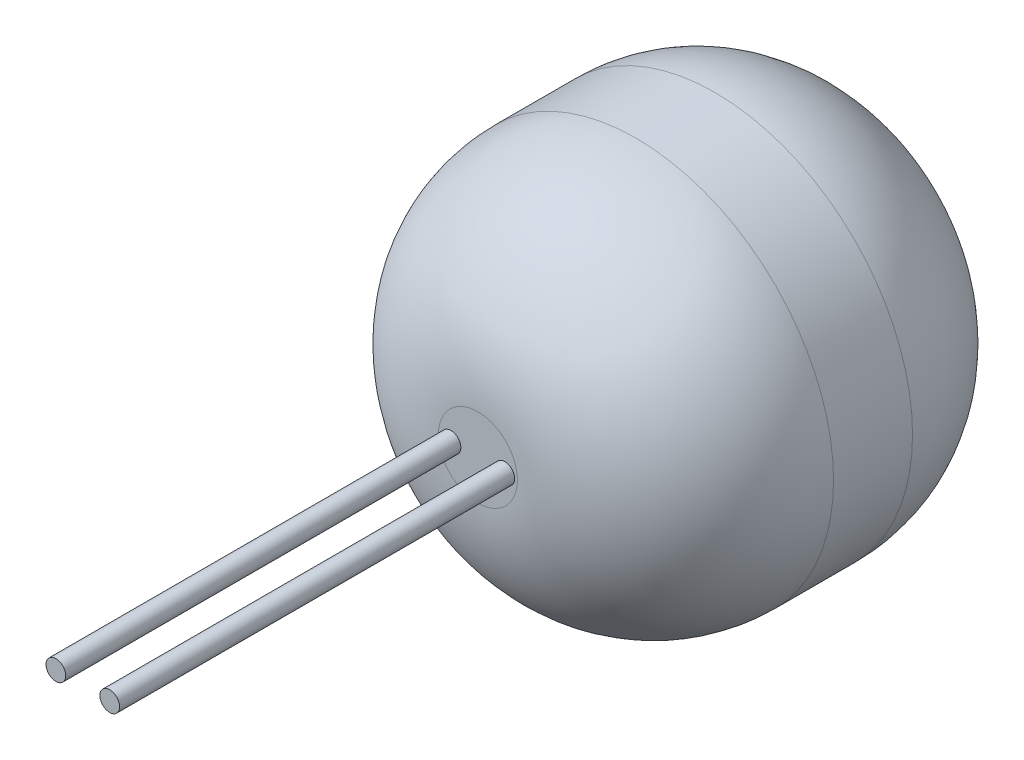
ISO-10303-21;
HEADER;
FILE_DESCRIPTION(('STEP AP214'),'2;1');
FILE_NAME('part.step','',(''),(''),'','','');
FILE_SCHEMA(('AUTOMOTIVE_DESIGN { 1 0 10303 214 1 1 1 1 }'));
ENDSEC;
DATA;
#1=APPLICATION_CONTEXT('core data for automotive mechanical design processes');
#2=APPLICATION_PROTOCOL_DEFINITION('international standard','automotive_design',2000,#1);
#3=PRODUCT_CONTEXT('',#1,'mechanical');
#4=PRODUCT('Part','Part','',(#3));
#5=PRODUCT_RELATED_PRODUCT_CATEGORY('part','',(#4));
#6=PRODUCT_DEFINITION_FORMATION('','',#4);
#7=PRODUCT_DEFINITION_CONTEXT('part definition',#1,'design');
#8=PRODUCT_DEFINITION('design','',#6,#7);
#9=PRODUCT_DEFINITION_SHAPE('','',#8);
#10=(LENGTH_UNIT() NAMED_UNIT(*) SI_UNIT(.MILLI.,.METRE.));
#11=(NAMED_UNIT(*) PLANE_ANGLE_UNIT() SI_UNIT($,.RADIAN.));
#12=(NAMED_UNIT(*) SI_UNIT($,.STERADIAN.) SOLID_ANGLE_UNIT());
#13=UNCERTAINTY_MEASURE_WITH_UNIT(LENGTH_MEASURE(1.E-05),#10,'distance_accuracy_value','');
#14=(GEOMETRIC_REPRESENTATION_CONTEXT(3) GLOBAL_UNCERTAINTY_ASSIGNED_CONTEXT((#13)) GLOBAL_UNIT_ASSIGNED_CONTEXT((#10,
#11,#12)) REPRESENTATION_CONTEXT('',''));
#15=CARTESIAN_POINT('',(0.,0.,0.));
#16=DIRECTION('',(0.,0.,1.));
#17=DIRECTION('',(1.,0.,0.));
#18=AXIS2_PLACEMENT_3D('',#15,#16,#17);
#19=CARTESIAN_POINT('',(-0.199999999999983,0.,0.));
#20=CARTESIAN_POINT('',(-0.199999999999983,-0.199999999999993,0.));
#21=CARTESIAN_POINT('',(0.,-0.199999999999993,0.));
#22=CARTESIAN_POINT('',(0.199999999999999,-0.199999999999993,0.));
#23=CARTESIAN_POINT('',(0.2,0.,0.));
#24=CARTESIAN_POINT('',(0.199999999999999,0.199999999999989,0.));
#25=CARTESIAN_POINT('',(0.,0.199999999999989,0.));
#26=CARTESIAN_POINT('',(-0.199999999999983,0.199999999999989,0.));
#27=CARTESIAN_POINT('',(-0.199999999999983,0.,0.));
#28=CARTESIAN_POINT('',(-1.,0.,0.));
#29=CARTESIAN_POINT('',(-1.,-1.00000000000001,0.));
#30=CARTESIAN_POINT('',(0.,-1.00000000000001,0.));
#31=CARTESIAN_POINT('',(1.00000000000001,-1.00000000000001,0.));
#32=CARTESIAN_POINT('',(1.00000000000002,0.,0.));
#33=CARTESIAN_POINT('',(1.00000000000001,1.00000000000001,0.));
#34=CARTESIAN_POINT('',(0.,1.00000000000001,0.));
#35=CARTESIAN_POINT('',(-1.,1.00000000000001,0.));
#36=CARTESIAN_POINT('',(-1.,0.,0.));
#37=CARTESIAN_POINT('',(-1.,0.,0.8));
#38=CARTESIAN_POINT('',(-0.999999999999999,-1.,0.800000000000002));
#39=CARTESIAN_POINT('',(0.,-1.,0.80000000000001));
#40=CARTESIAN_POINT('',(1.,-1.,0.800000000000019));
#41=CARTESIAN_POINT('',(1.,0.,0.800000000000017));
#42=CARTESIAN_POINT('',(1.,0.999999999999999,0.800000000000016));
#43=CARTESIAN_POINT('',(0.,1.,0.8));
#44=CARTESIAN_POINT('',(-0.999999999999999,0.999999999999999,0.799999999999999));
#45=CARTESIAN_POINT('',(-1.,0.,0.8));
#46=(BOUNDED_SURFACE() B_SPLINE_SURFACE(2,2,((#19,#20,#21,#22,#23,#24,#25,#26,#27),(#28,#29,#30,
#31,#32,#33,#34,#35,#36),(#37,#38,#39,#40,#41,#42,#43,#44,#45)),.UNSPECIFIED.,.F.,.T.,
.F.) B_SPLINE_SURFACE_WITH_KNOTS((3,3),(3,2,2,2,3),(-1.57079632679491,0.),(-3.14159265358979,
-1.5707963267949,0.,1.5707963267949,3.14159265358979),
.UNSPECIFIED.) GEOMETRIC_REPRESENTATION_ITEM() RATIONAL_B_SPLINE_SURFACE(((1.,0.707106781186548,
1.,0.707106781186548,1.,0.707106781186548,1.,0.707106781186548,1.),(0.707106781186538,
0.499999999999994,0.707106781186538,0.499999999999994,0.707106781186538,0.499999999999994,
0.707106781186538,0.499999999999994,0.707106781186538),(1.,0.707106781186548,1.,
0.707106781186548,1.,0.707106781186548,1.,0.707106781186548,1.))) REPRESENTATION_ITEM('') SURFACE());
#47=CARTESIAN_POINT('',(0.,0.,0.8));
#48=DIRECTION('',(0.,0.,-1.));
#49=DIRECTION('',(1.,0.,0.));
#50=AXIS2_PLACEMENT_3D('',#47,#48,#49);
#51=CIRCLE('',#50,1.);
#52=CARTESIAN_POINT('',(1.,0.,0.8));
#53=VERTEX_POINT('',#52);
#54=CARTESIAN_POINT('',(-1.,0.,0.8));
#55=VERTEX_POINT('',#54);
#56=EDGE_CURVE('E202',#53,#55,#51,.T.);
#57=CARTESIAN_POINT('',(-0.2,0.,0.8));
#58=DIRECTION('',(0.,-1.,0.));
#59=DIRECTION('',(-1.,0.,0.));
#60=AXIS2_PLACEMENT_3D('',#57,#58,#59);
#61=CIRCLE('',#60,0.8);
#62=CARTESIAN_POINT('',(-0.2,0.,0.));
#63=VERTEX_POINT('',#62);
#64=EDGE_CURVE('E11',#55,#63,#61,.T.);
#65=CARTESIAN_POINT('',(0.,0.,0.));
#66=DIRECTION('',(0.,0.,1.));
#67=DIRECTION('',(-1.,0.,0.));
#68=AXIS2_PLACEMENT_3D('',#65,#66,#67);
#69=CIRCLE('',#68,0.2);
#70=EDGE_CURVE('E197',#63,#63,#69,.T.);
#71=CARTESIAN_POINT('',(0.,0.,0.8));
#72=DIRECTION('',(0.,0.,-1.));
#73=DIRECTION('',(1.,0.,0.));
#74=AXIS2_PLACEMENT_3D('',#71,#72,#73);
#75=CIRCLE('',#74,1.);
#76=EDGE_CURVE('E31',#55,#53,#75,.T.);
#77=ORIENTED_EDGE('',*,*,#56,.T.);
#78=ORIENTED_EDGE('',*,*,#64,.T.);
#79=ORIENTED_EDGE('',*,*,#70,.T.);
#80=ORIENTED_EDGE('',*,*,#64,.F.);
#81=ORIENTED_EDGE('',*,*,#76,.T.);
#82=EDGE_LOOP('',(#77,#78,#79,#80,#81));
#83=FACE_BOUND('',#82,.T.);
#84=ADVANCED_FACE('F18',(#83),#46,.F.);
#85=CARTESIAN_POINT('',(0.,0.,2.));
#86=DIRECTION('',(0.,0.,-1.));
#87=DIRECTION('',(-1.,0.,0.));
#88=AXIS2_PLACEMENT_3D('',#85,#86,#87);
#89=CYLINDRICAL_SURFACE('',#88,1.);
#90=ORIENTED_EDGE('',*,*,#56,.F.);
#91=DIRECTION('',(0.,0.,1.));
#92=VECTOR('',#91,1.);
#93=CARTESIAN_POINT('',(1.,0.,2.));
#94=LINE('',#93,#92);
#95=CARTESIAN_POINT('',(1.,0.,1.2));
#96=VERTEX_POINT('',#95);
#97=EDGE_CURVE('E208',#53,#96,#94,.T.);
#98=ORIENTED_EDGE('',*,*,#97,.T.);
#99=CARTESIAN_POINT('',(0.,0.,1.2));
#100=DIRECTION('',(0.,0.,-1.));
#101=DIRECTION('',(-1.,0.,0.));
#102=AXIS2_PLACEMENT_3D('',#99,#100,#101);
#103=CIRCLE('',#102,1.);
#104=CARTESIAN_POINT('',(-1.,0.,1.2));
#105=VERTEX_POINT('',#104);
#106=EDGE_CURVE('E185',#96,#105,#103,.T.);
#107=ORIENTED_EDGE('',*,*,#106,.T.);
#108=CARTESIAN_POINT('',(0.,0.,1.2));
#109=DIRECTION('',(0.,0.,-1.));
#110=DIRECTION('',(-1.,0.,0.));
#111=AXIS2_PLACEMENT_3D('',#108,#109,#110);
#112=CIRCLE('',#111,1.);
#113=EDGE_CURVE('E191',#105,#96,#112,.T.);
#114=ORIENTED_EDGE('',*,*,#113,.T.);
#115=ORIENTED_EDGE('',*,*,#97,.F.);
#116=ORIENTED_EDGE('',*,*,#76,.F.);
#117=EDGE_LOOP('',(#90,#98,#107,#114,#115,#116));
#118=FACE_BOUND('',#117,.T.);
#119=ADVANCED_FACE('F233',(#118),#89,.T.);
#120=CARTESIAN_POINT('',(0.,0.,0.));
#121=DIRECTION('',(0.,0.,1.));
#122=DIRECTION('',(1.,0.,0.));
#123=AXIS2_PLACEMENT_3D('',#120,#121,#122);
#124=PLANE('',#123);
#125=ORIENTED_EDGE('',*,*,#70,.F.);
#126=EDGE_LOOP('',(#125));
#127=FACE_BOUND('',#126,.T.);
#128=ADVANCED_FACE('F227',(#127),#124,.F.);
#129=CARTESIAN_POINT('',(-1.,0.,1.2));
#130=CARTESIAN_POINT('',(-0.999999999999999,-1.,1.2));
#131=CARTESIAN_POINT('',(0.,-1.,1.2));
#132=CARTESIAN_POINT('',(1.,-1.,1.19999999999999));
#133=CARTESIAN_POINT('',(1.,0.,1.2));
#134=CARTESIAN_POINT('',(1.,1.,1.19999999999999));
#135=CARTESIAN_POINT('',(0.,1.,1.2));
#136=CARTESIAN_POINT('',(-0.999999999999999,1.,1.2));
#137=CARTESIAN_POINT('',(-1.,0.,1.2));
#138=CARTESIAN_POINT('',(-1.,0.,2.00000000000001));
#139=CARTESIAN_POINT('',(-1.,-1.,2.));
#140=CARTESIAN_POINT('',(0.,-1.00000000000001,2.));
#141=CARTESIAN_POINT('',(1.,-1.,2.));
#142=CARTESIAN_POINT('',(1.00000000000001,0.,2.));
#143=CARTESIAN_POINT('',(1.,1.,2.));
#144=CARTESIAN_POINT('',(0.,1.,2.00000000000001));
#145=CARTESIAN_POINT('',(-1.,1.,2.));
#146=CARTESIAN_POINT('',(-1.,0.,2.00000000000001));
#147=CARTESIAN_POINT('',(-0.199999999999989,0.,2.));
#148=CARTESIAN_POINT('',(-0.199999999999989,-0.199999999999996,2.));
#149=CARTESIAN_POINT('',(0.,-0.199999999999996,2.));
#150=CARTESIAN_POINT('',(0.2,-0.199999999999996,2.));
#151=CARTESIAN_POINT('',(0.2,0.,2.));
#152=CARTESIAN_POINT('',(0.2,0.199999999999994,2.));
#153=CARTESIAN_POINT('',(0.,0.199999999999994,2.));
#154=CARTESIAN_POINT('',(-0.199999999999989,0.199999999999994,2.));
#155=CARTESIAN_POINT('',(-0.199999999999989,0.,2.));
#156=(BOUNDED_SURFACE() B_SPLINE_SURFACE(2,2,((#129,#130,#131,#132,#133,#134,#135,#136,#137),
(#138,#139,#140,#141,#142,#143,#144,#145,#146),(#147,#148,#149,#150,#151,#152,#153,#154,#155)),
.UNSPECIFIED.,.F.,.T.,.F.) B_SPLINE_SURFACE_WITH_KNOTS((3,3),(3,2,2,2,3),(0.,1.5707963267949),
(-3.14159265358979,-1.5707963267949,0.,1.5707963267949,3.14159265358979),
.UNSPECIFIED.) GEOMETRIC_REPRESENTATION_ITEM() RATIONAL_B_SPLINE_SURFACE(((1.,0.707106781186548,
1.,0.707106781186548,1.,0.707106781186548,1.,0.707106781186548,1.),(0.707106781186544,0.5,
0.707106781186544,0.5,0.707106781186544,0.5,0.707106781186544,0.5,0.707106781186544),(1.,
0.707106781186548,1.,0.707106781186548,1.,0.707106781186548,1.,0.707106781186548,1.))) REPRESENTATION_ITEM('') SURFACE());
#157=CARTESIAN_POINT('',(0.,0.,2.));
#158=DIRECTION('',(0.,0.,-1.));
#159=DIRECTION('',(-1.,0.,0.));
#160=AXIS2_PLACEMENT_3D('',#157,#158,#159);
#161=CIRCLE('',#160,0.2);
#162=CARTESIAN_POINT('',(0.2,0.,2.));
#163=VERTEX_POINT('',#162);
#164=CARTESIAN_POINT('',(-0.2,0.,2.));
#165=VERTEX_POINT('',#164);
#166=EDGE_CURVE('E171',#163,#165,#161,.T.);
#167=CARTESIAN_POINT('',(-0.2,0.,1.2));
#168=DIRECTION('',(0.,-1.,0.));
#169=DIRECTION('',(-1.,0.,0.));
#170=AXIS2_PLACEMENT_3D('',#167,#168,#169);
#171=CIRCLE('',#170,0.8);
#172=EDGE_CURVE('E178',#165,#105,#171,.T.);
#173=CARTESIAN_POINT('',(0.2,0.,2.));
#174=CARTESIAN_POINT('',(0.2,0.00951159598298333,2.));
#175=CARTESIAN_POINT('',(0.199322227324771,0.0188384088479348,2.00000000000115));
#176=CARTESIAN_POINT('',(0.198042025666452,0.0279266888671592,1.99999999999884));
#177=CARTESIAN_POINT('',(0.196722206614986,0.0372962167352768,1.99999999999646));
#178=CARTESIAN_POINT('',(0.19476371367605,0.0464133678887298,2.00000000000122));
#179=CARTESIAN_POINT('',(0.192223729463243,0.0552683589098311,1.99999999991901));
#180=CARTESIAN_POINT('',(0.189610267102886,0.0643795122856133,1.99999999983441));
#181=CARTESIAN_POINT('',(0.186382152344486,0.0732150700448316,1.99999999968373));
#182=CARTESIAN_POINT('',(0.182554751415776,0.0817913524628018,1.99999999899236));
#183=CARTESIAN_POINT('',(0.178786030878937,0.0902361462746744,1.9999999983116));
#184=CARTESIAN_POINT('',(0.174435969856478,0.098431727932787,1.99999999714076));
#185=CARTESIAN_POINT('',(0.16946994153267,0.10638798344188,1.99999999422353));
#186=CARTESIAN_POINT('',(0.164771364056512,0.113915746171375,1.99999999146341));
#187=CARTESIAN_POINT('',(0.159520211291059,0.12123070515948,1.9999999871679));
#188=CARTESIAN_POINT('',(0.153654018601354,0.128310570406857,1.99999997911139));
#189=CARTESIAN_POINT('',(0.150070683414284,0.132635271555043,1.99999997419011));
#190=CARTESIAN_POINT('',(0.146257234036388,0.136871546902701,1.99999996784156));
#191=CARTESIAN_POINT('',(0.142196231585721,0.141005070911911,1.99999995925324));
#192=CARTESIAN_POINT('',(0.135727591993659,0.147589227751393,1.99999994557317));
#193=CARTESIAN_POINT('',(0.128973452950493,0.153529529700118,1.99999993623953));
#194=CARTESIAN_POINT('',(0.121991247499191,0.158898510206161,1.99999993348111));
#195=CARTESIAN_POINT('',(0.114665088148843,0.164531974734027,1.99999993058681));
#196=CARTESIAN_POINT('',(0.107086668527747,0.169538135665826,1.99999993438042));
#197=CARTESIAN_POINT('',(0.0992687039036917,0.173979668990145,1.99999994080036));
#198=CARTESIAN_POINT('',(0.0911575276182008,0.178587781395846,1.99999994746109));
#199=CARTESIAN_POINT('',(0.082786546152311,0.182589263063191,1.99999995658792));
#200=CARTESIAN_POINT('',(0.0741383393590951,0.186009299351428,1.99999996407846));
#201=CARTESIAN_POINT('',(0.0655979508851943,0.189386697602276,1.99999997147561));
#202=CARTESIAN_POINT('',(0.0567850336160773,0.192196947138207,1.99999997731295));
#203=CARTESIAN_POINT('',(0.0476842368823204,0.19441419294862,1.99999998051126));
#204=CARTESIAN_POINT('',(0.0388984579058258,0.196554690335468,1.99999998359886));
#205=CARTESIAN_POINT('',(0.0298428238251154,0.198141485550351,1.99999998458958));
#206=CARTESIAN_POINT('',(0.0205319549626767,0.19911326312913,1.99999998213662));
#207=CARTESIAN_POINT('',(0.0141949320147981,0.19977465970854,1.99999998046712));
#208=CARTESIAN_POINT('',(0.00774033322767537,0.200150297024631,1.99999997723062));
#209=CARTESIAN_POINT('',(0.00118552134796221,0.200215022129892,1.99999997015236));
#210=CARTESIAN_POINT('',(-0.00011448879233094,0.200227859003736,1.99999996874853));
#211=CARTESIAN_POINT('',(-0.00140143615451871,0.200227679268783,1.99999996739456));
#212=CARTESIAN_POINT('',(-0.00268835998462875,0.200214830041306,1.99999996610489));
#213=CARTESIAN_POINT('',(-0.0120273379821022,0.200121585476333,1.99999995674595));
#214=CARTESIAN_POINT('',(-0.0211788065880267,0.199359882918591,1.99999995136974));
#215=CARTESIAN_POINT('',(-0.0300905316097819,0.198007565118052,1.9999999506871));
#216=CARTESIAN_POINT('',(-0.0392946184822089,0.196610882603174,1.99999994998206));
#217=CARTESIAN_POINT('',(-0.048244102715582,0.194585759201041,1.99999995388747));
#218=CARTESIAN_POINT('',(-0.0569308093816965,0.191992559860824,1.99999995920398));
#219=CARTESIAN_POINT('',(-0.0659041918533658,0.189313780618074,1.99999996469593));
#220=CARTESIAN_POINT('',(-0.0745990665940584,0.186029789106311,1.99999997146504));
#221=CARTESIAN_POINT('',(-0.0830345494257173,0.182160279477119,1.9999999767997));
#222=CARTESIAN_POINT('',(-0.0913694404246262,0.178336913153915,1.99999998207076));
#223=CARTESIAN_POINT('',(-0.099453248636132,0.173941669067005,1.99999998599269));
#224=CARTESIAN_POINT('',(-0.107300313356857,0.168943612714184,1.99999998806193));
#225=CARTESIAN_POINT('',(-0.114761547031893,0.164191304979178,1.99999999002942));
#226=CARTESIAN_POINT('',(-0.122010232313904,0.158892885975742,1.9999999905793));
#227=CARTESIAN_POINT('',(-0.129029006836039,0.15298699031493,1.99999998882522));
#228=CARTESIAN_POINT('',(-0.132990737798776,0.149653421238399,1.99999998783513));
#229=CARTESIAN_POINT('',(-0.136878544968985,0.146125735744795,1.99999998608855));
#230=CARTESIAN_POINT('',(-0.140682341760534,0.142390102533373,1.99999998275934));
#231=CARTESIAN_POINT('',(-0.148134810063511,0.135071181564324,1.9999999762367));
#232=CARTESIAN_POINT('',(-0.154866554075447,0.127251905925044,1.99999997986422));
#233=CARTESIAN_POINT('',(-0.160913704264103,0.119033273234747,1.99999998492802));
#234=CARTESIAN_POINT('',(-0.167563934120358,0.109994999868039,1.99999999049683));
#235=CARTESIAN_POINT('',(-0.173388691635102,0.100472868445307,1.99999999539628));
#236=CARTESIAN_POINT('',(-0.178426691924196,0.0905381457155792,1.99999999568573));
#237=CARTESIAN_POINT('',(-0.180916416045331,0.0856285154262497,1.99999999582877));
#238=CARTESIAN_POINT('',(-0.183213594679701,0.0806172892267724,1.99999999531903));
#239=CARTESIAN_POINT('',(-0.185319741914912,0.0755097353325866,1.99999999204966));
#240=CARTESIAN_POINT('',(-0.188425232440904,0.0679787042801475,1.99999998722901));
#241=CARTESIAN_POINT('',(-0.190959063112136,0.0604624292412581,1.99999998601829));
#242=CARTESIAN_POINT('',(-0.193012904551155,0.0529258911726011,1.99999998813529));
#243=CARTESIAN_POINT('',(-0.195127140269011,0.0451677372708312,1.99999999031454));
#244=CARTESIAN_POINT('',(-0.196732918406062,0.0373862666520254,1.99999999471368));
#245=CARTESIAN_POINT('',(-0.197877375607493,0.0295257478835585,1.99999999710555));
#246=CARTESIAN_POINT('',(-0.199040004473846,0.0215404199802465,1.9999999995354));
#247=CARTESIAN_POINT('',(-0.199726111125181,0.0134717624211997,1.99999999996223));
#248=CARTESIAN_POINT('',(-0.199933451067819,0.00527120946915874,1.99999999999465));
#249=CARTESIAN_POINT('',(-0.199977723856487,0.00352016554009333,2.00000000000157));
#250=CARTESIAN_POINT('',(-0.2,0.00176319678966468,2.));
#251=CARTESIAN_POINT('',(-0.2,0.,2.));
#252=(BOUNDED_CURVE() B_SPLINE_CURVE(3,(#173,#174,#175,#176,#177,#178,#179,#180,#181,#182,#183,
#184,#185,#186,#187,#188,#189,#190,#191,#192,#193,#194,#195,#196,#197,#198,#199,#200,#201,#202,
#203,#204,#205,#206,#207,#208,#209,#210,#211,#212,#213,#214,#215,#216,#217,#218,#219,#220,#221,
#222,#223,#224,#225,#226,#227,#228,#229,#230,#231,#232,#233,#234,#235,#236,#237,#238,#239,#240,
#241,#242,#243,#244,#245,#246,#247,#248,#249,#250,#251),.UNSPECIFIED.,.F.,
.F.) B_SPLINE_CURVE_WITH_KNOTS((4,3,3,3,3,3,3,3,3,3,3,3,3,3,3,3,3,3,3,3,3,3,3,3,3,3,4),(0.,
0.0436441356046354,0.088638891924042,0.134935282846985,0.180521873460992,0.223653348738104,0.25,
0.291966729530765,0.336000803019389,0.381686368228457,0.426802365551884,0.470356703966837,0.5,
0.505879129125596,0.548542926518756,0.592606370639358,0.638123981894215,0.683098802649715,
0.725862263777206,0.75,0.797291094651971,0.849298509678562,0.875,0.912896559823882,
0.951907487756963,0.991537830299723,1.),
.UNSPECIFIED.) CURVE() GEOMETRIC_REPRESENTATION_ITEM() RATIONAL_B_SPLINE_CURVE((1.,1.,1.,1.,1.,
1.,1.,1.,1.,1.,1.,1.,1.,1.,1.,1.,1.,1.,1.,1.,1.,1.,1.,1.,1.,1.,1.,1.,1.,1.,1.,1.,1.,1.,1.,1.,1.,
1.,1.,1.,1.,1.,1.,1.,1.,1.,1.,1.,1.,1.,1.,1.,1.,1.,1.,1.,1.,1.,1.,1.,1.,1.,1.,1.,1.,1.,1.,1.,1.,
1.,1.,1.,1.,1.,1.,1.,1.,1.,1.)) REPRESENTATION_ITEM(''));
#253=EDGE_CURVE('E165',#163,#165,#252,.T.);
#254=ORIENTED_EDGE('',*,*,#166,.T.);
#255=ORIENTED_EDGE('',*,*,#172,.T.);
#256=ORIENTED_EDGE('',*,*,#106,.F.);
#257=ORIENTED_EDGE('',*,*,#113,.F.);
#258=ORIENTED_EDGE('',*,*,#172,.F.);
#259=ORIENTED_EDGE('',*,*,#253,.F.);
#260=EDGE_LOOP('',(#254,#255,#256,#257,#258,#259));
#261=FACE_BOUND('',#260,.T.);
#262=ADVANCED_FACE('F20',(#261),#156,.F.);
#263=CARTESIAN_POINT('',(0.,0.,2.));
#264=DIRECTION('',(0.,0.,1.));
#265=DIRECTION('',(1.,0.,0.));
#266=AXIS2_PLACEMENT_3D('',#263,#264,#265);
#267=PLANE('',#266);
#268=CARTESIAN_POINT('',(0.136233706431234,0.,2.));
#269=DIRECTION('',(0.,0.,-1.));
#270=DIRECTION('',(-1.,0.,0.));
#271=AXIS2_PLACEMENT_3D('',#268,#269,#270);
#272=CIRCLE('',#271,0.05);
#273=CARTESIAN_POINT('',(0.0862337064312338,0.,2.));
#274=VERTEX_POINT('',#273);
#275=CARTESIAN_POINT('',(0.186233706431234,0.,2.));
#276=VERTEX_POINT('',#275);
#277=EDGE_CURVE('E123',#274,#276,#272,.T.);
#278=ORIENTED_EDGE('',*,*,#277,.T.);
#279=CARTESIAN_POINT('',(0.136233706431234,0.,2.));
#280=DIRECTION('',(0.,0.,-1.));
#281=DIRECTION('',(-1.,0.,0.));
#282=AXIS2_PLACEMENT_3D('',#279,#280,#281);
#283=CIRCLE('',#282,0.05);
#284=EDGE_CURVE('E131',#276,#274,#283,.T.);
#285=ORIENTED_EDGE('',*,*,#284,.T.);
#286=EDGE_LOOP('',(#278,#285));
#287=FACE_BOUND('',#286,.T.);
#288=CARTESIAN_POINT('',(-0.136275076217566,0.,2.));
#289=DIRECTION('',(0.,0.,-1.));
#290=DIRECTION('',(-1.,0.,0.));
#291=AXIS2_PLACEMENT_3D('',#288,#289,#290);
#292=CIRCLE('',#291,0.05);
#293=CARTESIAN_POINT('',(-0.186275076217566,0.,2.));
#294=VERTEX_POINT('',#293);
#295=CARTESIAN_POINT('',(-0.0862750762175658,0.,2.));
#296=VERTEX_POINT('',#295);
#297=EDGE_CURVE('E144',#294,#296,#292,.T.);
#298=ORIENTED_EDGE('',*,*,#297,.T.);
#299=CARTESIAN_POINT('',(-0.136275076217566,0.,2.));
#300=DIRECTION('',(0.,0.,-1.));
#301=DIRECTION('',(-1.,0.,0.));
#302=AXIS2_PLACEMENT_3D('',#299,#300,#301);
#303=CIRCLE('',#302,0.05);
#304=EDGE_CURVE('E153',#296,#294,#303,.T.);
#305=ORIENTED_EDGE('',*,*,#304,.T.);
#306=EDGE_LOOP('',(#298,#305));
#307=FACE_BOUND('',#306,.T.);
#308=ORIENTED_EDGE('',*,*,#253,.T.);
#309=ORIENTED_EDGE('',*,*,#166,.F.);
#310=EDGE_LOOP('',(#308,#309));
#311=FACE_BOUND('',#310,.T.);
#312=ADVANCED_FACE('F226',(#287,#307,#311),#267,.T.);
#313=CARTESIAN_POINT('',(-0.136275076217566,0.,4.));
#314=DIRECTION('',(0.,0.,-1.));
#315=DIRECTION('',(-1.,0.,0.));
#316=AXIS2_PLACEMENT_3D('',#313,#314,#315);
#317=CYLINDRICAL_SURFACE('',#316,0.05);
#318=ORIENTED_EDGE('',*,*,#297,.F.);
#319=ORIENTED_EDGE('',*,*,#304,.F.);
#320=DIRECTION('',(0.,0.,1.));
#321=VECTOR('',#320,1.);
#322=CARTESIAN_POINT('',(-0.0862750762175658,0.,4.));
#323=LINE('',#322,#321);
#324=CARTESIAN_POINT('',(-0.0862750762175658,0.,4.));
#325=VERTEX_POINT('',#324);
#326=EDGE_CURVE('E158',#296,#325,#323,.T.);
#327=ORIENTED_EDGE('',*,*,#326,.T.);
#328=CARTESIAN_POINT('',(-0.136275076217566,0.,4.));
#329=DIRECTION('',(0.,0.,-1.));
#330=DIRECTION('',(-1.,0.,0.));
#331=AXIS2_PLACEMENT_3D('',#328,#329,#330);
#332=CIRCLE('',#331,0.05);
#333=CARTESIAN_POINT('',(-0.186275076217566,0.,4.));
#334=VERTEX_POINT('',#333);
#335=EDGE_CURVE('E115',#325,#334,#332,.T.);
#336=ORIENTED_EDGE('',*,*,#335,.T.);
#337=CARTESIAN_POINT('',(-0.136275076217566,0.,4.));
#338=DIRECTION('',(0.,0.,-1.));
#339=DIRECTION('',(-1.,0.,0.));
#340=AXIS2_PLACEMENT_3D('',#337,#338,#339);
#341=CIRCLE('',#340,0.05);
#342=EDGE_CURVE('E94',#334,#325,#341,.T.);
#343=ORIENTED_EDGE('',*,*,#342,.T.);
#344=ORIENTED_EDGE('',*,*,#326,.F.);
#345=EDGE_LOOP('',(#318,#319,#327,#336,#343,#344));
#346=FACE_BOUND('',#345,.T.);
#347=ADVANCED_FACE('F256',(#346),#317,.T.);
#348=CARTESIAN_POINT('',(0.136233706431234,0.,4.));
#349=DIRECTION('',(0.,0.,-1.));
#350=DIRECTION('',(-1.,0.,0.));
#351=AXIS2_PLACEMENT_3D('',#348,#349,#350);
#352=CYLINDRICAL_SURFACE('',#351,0.05);
#353=ORIENTED_EDGE('',*,*,#277,.F.);
#354=ORIENTED_EDGE('',*,*,#284,.F.);
#355=DIRECTION('',(0.,0.,1.));
#356=VECTOR('',#355,1.);
#357=CARTESIAN_POINT('',(0.186233706431234,0.,4.));
#358=LINE('',#357,#356);
#359=CARTESIAN_POINT('',(0.186233706431234,0.,4.));
#360=VERTEX_POINT('',#359);
#361=EDGE_CURVE('E91',#276,#360,#358,.T.);
#362=ORIENTED_EDGE('',*,*,#361,.T.);
#363=CARTESIAN_POINT('',(0.136233706431234,0.,4.));
#364=DIRECTION('',(0.,0.,-1.));
#365=DIRECTION('',(-1.,0.,0.));
#366=AXIS2_PLACEMENT_3D('',#363,#364,#365);
#367=CIRCLE('',#366,0.05);
#368=CARTESIAN_POINT('',(0.0862337064312338,0.,4.));
#369=VERTEX_POINT('',#368);
#370=EDGE_CURVE('E86',#360,#369,#367,.T.);
#371=ORIENTED_EDGE('',*,*,#370,.T.);
#372=CARTESIAN_POINT('',(0.136233706431234,0.,4.));
#373=DIRECTION('',(0.,0.,-1.));
#374=DIRECTION('',(-1.,0.,0.));
#375=AXIS2_PLACEMENT_3D('',#372,#373,#374);
#376=CIRCLE('',#375,0.05);
#377=EDGE_CURVE('E24',#369,#360,#376,.T.);
#378=ORIENTED_EDGE('',*,*,#377,.T.);
#379=ORIENTED_EDGE('',*,*,#361,.F.);
#380=EDGE_LOOP('',(#353,#354,#362,#371,#378,#379));
#381=FACE_BOUND('',#380,.T.);
#382=ADVANCED_FACE('F89',(#381),#352,.T.);
#383=CARTESIAN_POINT('',(-0.136275076217566,0.,4.));
#384=DIRECTION('',(0.,0.,1.));
#385=DIRECTION('',(1.,0.,0.));
#386=AXIS2_PLACEMENT_3D('',#383,#384,#385);
#387=PLANE('',#386);
#388=ORIENTED_EDGE('',*,*,#342,.F.);
#389=ORIENTED_EDGE('',*,*,#335,.F.);
#390=EDGE_LOOP('',(#388,#389));
#391=FACE_BOUND('',#390,.T.);
#392=ADVANCED_FACE('F244',(#391),#387,.T.);
#393=CARTESIAN_POINT('',(0.136233706431234,0.,4.));
#394=DIRECTION('',(0.,0.,1.));
#395=DIRECTION('',(1.,0.,0.));
#396=AXIS2_PLACEMENT_3D('',#393,#394,#395);
#397=PLANE('',#396);
#398=ORIENTED_EDGE('',*,*,#377,.F.);
#399=ORIENTED_EDGE('',*,*,#370,.F.);
#400=EDGE_LOOP('',(#398,#399));
#401=FACE_BOUND('',#400,.T.);
#402=ADVANCED_FACE('F96',(#401),#397,.T.);
#403=CLOSED_SHELL('',(#84,#119,#128,#262,#312,#347,#382,#392,#402));
#404=MANIFOLD_SOLID_BREP('B1',#403);
#405=ADVANCED_BREP_SHAPE_REPRESENTATION('',(#18,#404),#14);
#406=SHAPE_DEFINITION_REPRESENTATION(#9,#405);
ENDSEC;
END-ISO-10303-21;
